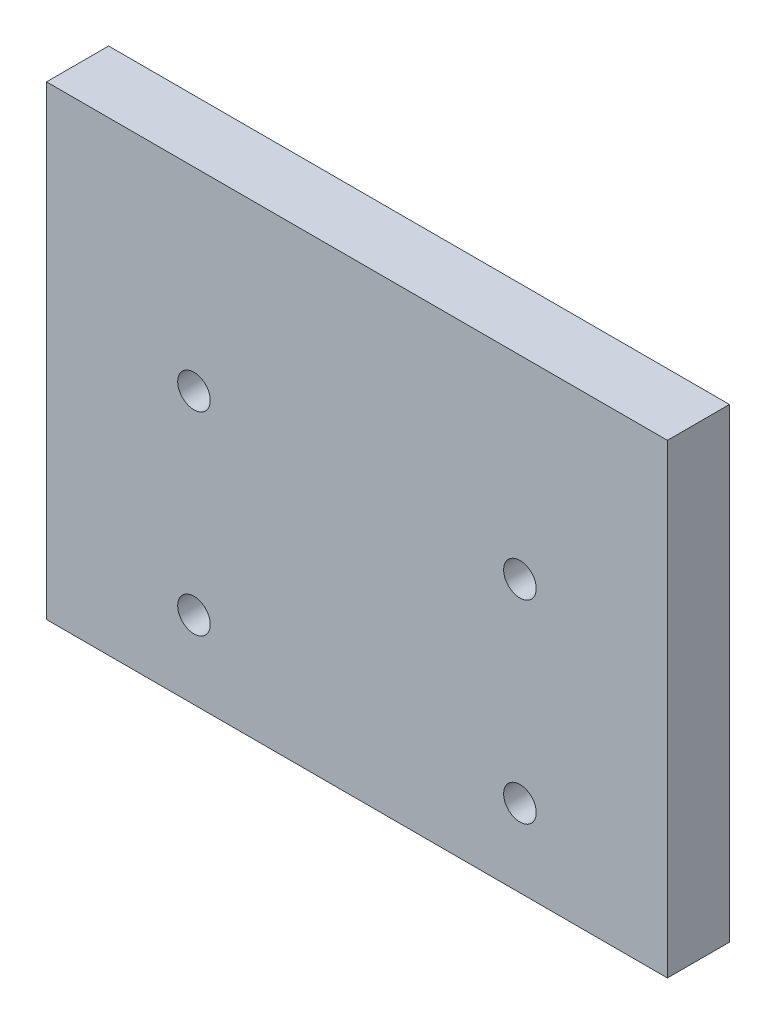
ISO-10303-21;
HEADER;
FILE_DESCRIPTION(('STEP AP214'),'2;1');
FILE_NAME('part.step','',(''),(''),'','','');
FILE_SCHEMA(('AUTOMOTIVE_DESIGN { 1 0 10303 214 1 1 1 1 }'));
ENDSEC;
DATA;
#1=APPLICATION_CONTEXT('core data for automotive mechanical design processes');
#2=APPLICATION_PROTOCOL_DEFINITION('international standard','automotive_design',2000,#1);
#3=PRODUCT_CONTEXT('',#1,'mechanical');
#4=PRODUCT('Part','Part','',(#3));
#5=PRODUCT_RELATED_PRODUCT_CATEGORY('part','',(#4));
#6=PRODUCT_DEFINITION_FORMATION('','',#4);
#7=PRODUCT_DEFINITION_CONTEXT('part definition',#1,'design');
#8=PRODUCT_DEFINITION('design','',#6,#7);
#9=PRODUCT_DEFINITION_SHAPE('','',#8);
#10=(LENGTH_UNIT() NAMED_UNIT(*) SI_UNIT(.MILLI.,.METRE.));
#11=(NAMED_UNIT(*) PLANE_ANGLE_UNIT() SI_UNIT($,.RADIAN.));
#12=(NAMED_UNIT(*) SI_UNIT($,.STERADIAN.) SOLID_ANGLE_UNIT());
#13=UNCERTAINTY_MEASURE_WITH_UNIT(LENGTH_MEASURE(1.E-05),#10,'distance_accuracy_value','');
#14=(GEOMETRIC_REPRESENTATION_CONTEXT(3) GLOBAL_UNCERTAINTY_ASSIGNED_CONTEXT((#13)) GLOBAL_UNIT_ASSIGNED_CONTEXT((#10,
#11,#12)) REPRESENTATION_CONTEXT('',''));
#15=CARTESIAN_POINT('',(0.,0.,0.));
#16=DIRECTION('',(0.,0.,1.));
#17=DIRECTION('',(1.,0.,0.));
#18=AXIS2_PLACEMENT_3D('',#15,#16,#17);
#19=CARTESIAN_POINT('',(20.,15.,4.));
#20=DIRECTION('',(-1.,0.,0.));
#21=DIRECTION('',(0.,-1.,0.));
#22=AXIS2_PLACEMENT_3D('',#19,#20,#21);
#23=PLANE('',#22);
#24=DIRECTION('',(0.,1.,0.));
#25=VECTOR('',#24,1.);
#26=CARTESIAN_POINT('',(20.,15.,0.));
#27=LINE('',#26,#25);
#28=CARTESIAN_POINT('',(20.,-15.,0.));
#29=VERTEX_POINT('',#28);
#30=CARTESIAN_POINT('',(20.,15.,0.));
#31=VERTEX_POINT('',#30);
#32=EDGE_CURVE('E95',#29,#31,#27,.T.);
#33=ORIENTED_EDGE('',*,*,#32,.T.);
#34=DIRECTION('',(0.,0.,-1.));
#35=VECTOR('',#34,1.);
#36=CARTESIAN_POINT('',(20.,15.,4.));
#37=LINE('',#36,#35);
#38=CARTESIAN_POINT('',(20.,15.,4.));
#39=VERTEX_POINT('',#38);
#40=EDGE_CURVE('E11',#39,#31,#37,.T.);
#41=ORIENTED_EDGE('',*,*,#40,.F.);
#42=DIRECTION('',(0.,1.,0.));
#43=VECTOR('',#42,1.);
#44=CARTESIAN_POINT('',(20.,15.,4.));
#45=LINE('',#44,#43);
#46=CARTESIAN_POINT('',(20.,-15.,4.));
#47=VERTEX_POINT('',#46);
#48=EDGE_CURVE('E83',#47,#39,#45,.T.);
#49=ORIENTED_EDGE('',*,*,#48,.F.);
#50=DIRECTION('',(0.,0.,-1.));
#51=VECTOR('',#50,1.);
#52=CARTESIAN_POINT('',(20.,-15.,4.));
#53=LINE('',#52,#51);
#54=EDGE_CURVE('E91',#47,#29,#53,.T.);
#55=ORIENTED_EDGE('',*,*,#54,.T.);
#56=EDGE_LOOP('',(#33,#41,#49,#55));
#57=FACE_BOUND('',#56,.T.);
#58=ADVANCED_FACE('F32',(#57),#23,.F.);
#59=CARTESIAN_POINT('',(-20.,15.,4.));
#60=DIRECTION('',(0.,-1.,0.));
#61=DIRECTION('',(0.,0.,-1.));
#62=AXIS2_PLACEMENT_3D('',#59,#60,#61);
#63=PLANE('',#62);
#64=DIRECTION('',(-1.,0.,0.));
#65=VECTOR('',#64,1.);
#66=CARTESIAN_POINT('',(-20.,15.,0.));
#67=LINE('',#66,#65);
#68=CARTESIAN_POINT('',(-20.,15.,0.));
#69=VERTEX_POINT('',#68);
#70=EDGE_CURVE('E87',#31,#69,#67,.T.);
#71=ORIENTED_EDGE('',*,*,#70,.T.);
#72=DIRECTION('',(0.,0.,-1.));
#73=VECTOR('',#72,1.);
#74=CARTESIAN_POINT('',(-20.,15.,4.));
#75=LINE('',#74,#73);
#76=CARTESIAN_POINT('',(-20.,15.,4.));
#77=VERTEX_POINT('',#76);
#78=EDGE_CURVE('E40',#77,#69,#75,.T.);
#79=ORIENTED_EDGE('',*,*,#78,.F.);
#80=DIRECTION('',(-1.,0.,0.));
#81=VECTOR('',#80,1.);
#82=CARTESIAN_POINT('',(-20.,15.,4.));
#83=LINE('',#82,#81);
#84=EDGE_CURVE('E78',#39,#77,#83,.T.);
#85=ORIENTED_EDGE('',*,*,#84,.F.);
#86=ORIENTED_EDGE('',*,*,#40,.T.);
#87=EDGE_LOOP('',(#71,#79,#85,#86));
#88=FACE_BOUND('',#87,.T.);
#89=ADVANCED_FACE('F86',(#88),#63,.F.);
#90=CARTESIAN_POINT('',(-20.,15.,4.));
#91=DIRECTION('',(1.,0.,0.));
#92=DIRECTION('',(0.,1.,0.));
#93=AXIS2_PLACEMENT_3D('',#90,#91,#92);
#94=PLANE('',#93);
#95=DIRECTION('',(0.,-1.,0.));
#96=VECTOR('',#95,1.);
#97=CARTESIAN_POINT('',(-20.,15.,0.));
#98=LINE('',#97,#96);
#99=CARTESIAN_POINT('',(-20.,-15.,0.));
#100=VERTEX_POINT('',#99);
#101=EDGE_CURVE('E65',#69,#100,#98,.T.);
#102=ORIENTED_EDGE('',*,*,#101,.T.);
#103=DIRECTION('',(0.,0.,-1.));
#104=VECTOR('',#103,1.);
#105=CARTESIAN_POINT('',(-20.,-15.,4.));
#106=LINE('',#105,#104);
#107=CARTESIAN_POINT('',(-20.,-15.,4.));
#108=VERTEX_POINT('',#107);
#109=EDGE_CURVE('E88',#108,#100,#106,.T.);
#110=ORIENTED_EDGE('',*,*,#109,.F.);
#111=DIRECTION('',(0.,-1.,0.));
#112=VECTOR('',#111,1.);
#113=CARTESIAN_POINT('',(-20.,15.,4.));
#114=LINE('',#113,#112);
#115=EDGE_CURVE('E81',#77,#108,#114,.T.);
#116=ORIENTED_EDGE('',*,*,#115,.F.);
#117=ORIENTED_EDGE('',*,*,#78,.T.);
#118=EDGE_LOOP('',(#102,#110,#116,#117));
#119=FACE_BOUND('',#118,.T.);
#120=ADVANCED_FACE('F89',(#119),#94,.F.);
#121=CARTESIAN_POINT('',(-20.,-15.,4.));
#122=DIRECTION('',(0.,1.,0.));
#123=DIRECTION('',(0.,0.,1.));
#124=AXIS2_PLACEMENT_3D('',#121,#122,#123);
#125=PLANE('',#124);
#126=DIRECTION('',(1.,0.,0.));
#127=VECTOR('',#126,1.);
#128=CARTESIAN_POINT('',(-20.,-15.,0.));
#129=LINE('',#128,#127);
#130=EDGE_CURVE('E71',#100,#29,#129,.T.);
#131=ORIENTED_EDGE('',*,*,#130,.T.);
#132=ORIENTED_EDGE('',*,*,#54,.F.);
#133=DIRECTION('',(1.,0.,0.));
#134=VECTOR('',#133,1.);
#135=CARTESIAN_POINT('',(-20.,-15.,4.));
#136=LINE('',#135,#134);
#137=EDGE_CURVE('E48',#108,#47,#136,.T.);
#138=ORIENTED_EDGE('',*,*,#137,.F.);
#139=ORIENTED_EDGE('',*,*,#109,.T.);
#140=EDGE_LOOP('',(#131,#132,#138,#139));
#141=FACE_BOUND('',#140,.T.);
#142=ADVANCED_FACE('F103',(#141),#125,.F.);
#143=CARTESIAN_POINT('',(0.,0.,4.));
#144=DIRECTION('',(0.,0.,1.));
#145=DIRECTION('',(1.,0.,0.));
#146=AXIS2_PLACEMENT_3D('',#143,#144,#145);
#147=PLANE('',#146);
#148=CARTESIAN_POINT('',(-10.5,-10.,4.));
#149=DIRECTION('',(0.,0.,-1.));
#150=DIRECTION('',(-1.,0.,0.));
#151=AXIS2_PLACEMENT_3D('',#148,#149,#150);
#152=CIRCLE('',#151,1.05);
#153=CARTESIAN_POINT('',(-11.55,-10.,4.));
#154=VERTEX_POINT('',#153);
#155=EDGE_CURVE('E124',#154,#154,#152,.T.);
#156=ORIENTED_EDGE('',*,*,#155,.T.);
#157=EDGE_LOOP('',(#156));
#158=FACE_BOUND('',#157,.T.);
#159=CARTESIAN_POINT('',(10.5,-10.,4.));
#160=DIRECTION('',(0.,0.,-1.));
#161=DIRECTION('',(-1.,0.,0.));
#162=AXIS2_PLACEMENT_3D('',#159,#160,#161);
#163=CIRCLE('',#162,1.05);
#164=CARTESIAN_POINT('',(9.45,-10.,4.));
#165=VERTEX_POINT('',#164);
#166=EDGE_CURVE('E118',#165,#165,#163,.T.);
#167=ORIENTED_EDGE('',*,*,#166,.T.);
#168=EDGE_LOOP('',(#167));
#169=FACE_BOUND('',#168,.T.);
#170=CARTESIAN_POINT('',(-10.5,2.50000000000001,4.));
#171=DIRECTION('',(0.,0.,-1.));
#172=DIRECTION('',(-1.,0.,0.));
#173=AXIS2_PLACEMENT_3D('',#170,#171,#172);
#174=CIRCLE('',#173,1.05);
#175=CARTESIAN_POINT('',(-11.55,2.50000000000001,4.));
#176=VERTEX_POINT('',#175);
#177=EDGE_CURVE('E112',#176,#176,#174,.T.);
#178=ORIENTED_EDGE('',*,*,#177,.T.);
#179=EDGE_LOOP('',(#178));
#180=FACE_BOUND('',#179,.T.);
#181=CARTESIAN_POINT('',(10.5,2.50000000000001,4.));
#182=DIRECTION('',(0.,0.,-1.));
#183=DIRECTION('',(-1.,0.,0.));
#184=AXIS2_PLACEMENT_3D('',#181,#182,#183);
#185=CIRCLE('',#184,1.05);
#186=CARTESIAN_POINT('',(9.45,2.50000000000001,4.));
#187=VERTEX_POINT('',#186);
#188=EDGE_CURVE('E98',#187,#187,#185,.T.);
#189=ORIENTED_EDGE('',*,*,#188,.T.);
#190=EDGE_LOOP('',(#189));
#191=FACE_BOUND('',#190,.T.);
#192=ORIENTED_EDGE('',*,*,#48,.T.);
#193=ORIENTED_EDGE('',*,*,#84,.T.);
#194=ORIENTED_EDGE('',*,*,#115,.T.);
#195=ORIENTED_EDGE('',*,*,#137,.T.);
#196=EDGE_LOOP('',(#192,#193,#194,#195));
#197=FACE_BOUND('',#196,.T.);
#198=ADVANCED_FACE('F79',(#158,#169,#180,#191,#197),#147,.T.);
#199=CARTESIAN_POINT('',(0.,0.,0.));
#200=DIRECTION('',(0.,0.,1.));
#201=DIRECTION('',(1.,0.,0.));
#202=AXIS2_PLACEMENT_3D('',#199,#200,#201);
#203=PLANE('',#202);
#204=CARTESIAN_POINT('',(-10.5,-10.,0.));
#205=DIRECTION('',(0.,0.,-1.));
#206=DIRECTION('',(-1.,0.,0.));
#207=AXIS2_PLACEMENT_3D('',#204,#205,#206);
#208=CIRCLE('',#207,1.05);
#209=CARTESIAN_POINT('',(-11.55,-10.,0.));
#210=VERTEX_POINT('',#209);
#211=EDGE_CURVE('E127',#210,#210,#208,.T.);
#212=ORIENTED_EDGE('',*,*,#211,.F.);
#213=EDGE_LOOP('',(#212));
#214=FACE_BOUND('',#213,.T.);
#215=CARTESIAN_POINT('',(10.5,-10.,0.));
#216=DIRECTION('',(0.,0.,-1.));
#217=DIRECTION('',(-1.,0.,0.));
#218=AXIS2_PLACEMENT_3D('',#215,#216,#217);
#219=CIRCLE('',#218,1.05);
#220=CARTESIAN_POINT('',(9.45,-10.,0.));
#221=VERTEX_POINT('',#220);
#222=EDGE_CURVE('E121',#221,#221,#219,.T.);
#223=ORIENTED_EDGE('',*,*,#222,.F.);
#224=EDGE_LOOP('',(#223));
#225=FACE_BOUND('',#224,.T.);
#226=CARTESIAN_POINT('',(-10.5,2.50000000000001,0.));
#227=DIRECTION('',(0.,0.,-1.));
#228=DIRECTION('',(-1.,0.,0.));
#229=AXIS2_PLACEMENT_3D('',#226,#227,#228);
#230=CIRCLE('',#229,1.05);
#231=CARTESIAN_POINT('',(-11.55,2.50000000000001,0.));
#232=VERTEX_POINT('',#231);
#233=EDGE_CURVE('E115',#232,#232,#230,.T.);
#234=ORIENTED_EDGE('',*,*,#233,.F.);
#235=EDGE_LOOP('',(#234));
#236=FACE_BOUND('',#235,.T.);
#237=CARTESIAN_POINT('',(10.5,2.50000000000001,0.));
#238=DIRECTION('',(0.,0.,-1.));
#239=DIRECTION('',(-1.,0.,0.));
#240=AXIS2_PLACEMENT_3D('',#237,#238,#239);
#241=CIRCLE('',#240,1.05);
#242=CARTESIAN_POINT('',(9.45,2.50000000000001,0.));
#243=VERTEX_POINT('',#242);
#244=EDGE_CURVE('E109',#243,#243,#241,.T.);
#245=ORIENTED_EDGE('',*,*,#244,.F.);
#246=EDGE_LOOP('',(#245));
#247=FACE_BOUND('',#246,.T.);
#248=ORIENTED_EDGE('',*,*,#32,.F.);
#249=ORIENTED_EDGE('',*,*,#130,.F.);
#250=ORIENTED_EDGE('',*,*,#101,.F.);
#251=ORIENTED_EDGE('',*,*,#70,.F.);
#252=EDGE_LOOP('',(#248,#249,#250,#251));
#253=FACE_BOUND('',#252,.T.);
#254=ADVANCED_FACE('F106',(#214,#225,#236,#247,#253),#203,.F.);
#255=CARTESIAN_POINT('',(10.5,2.50000000000001,4.));
#256=DIRECTION('',(0.,0.,-1.));
#257=DIRECTION('',(-1.,0.,0.));
#258=AXIS2_PLACEMENT_3D('',#255,#256,#257);
#259=CYLINDRICAL_SURFACE('',#258,1.05);
#260=ORIENTED_EDGE('',*,*,#188,.F.);
#261=EDGE_LOOP('',(#260));
#262=FACE_BOUND('',#261,.T.);
#263=ORIENTED_EDGE('',*,*,#244,.T.);
#264=EDGE_LOOP('',(#263));
#265=FACE_BOUND('',#264,.T.);
#266=ADVANCED_FACE('F144',(#262,#265),#259,.F.);
#267=CARTESIAN_POINT('',(-10.5,2.50000000000001,4.));
#268=DIRECTION('',(0.,0.,-1.));
#269=DIRECTION('',(-1.,0.,0.));
#270=AXIS2_PLACEMENT_3D('',#267,#268,#269);
#271=CYLINDRICAL_SURFACE('',#270,1.05);
#272=ORIENTED_EDGE('',*,*,#177,.F.);
#273=EDGE_LOOP('',(#272));
#274=FACE_BOUND('',#273,.T.);
#275=ORIENTED_EDGE('',*,*,#233,.T.);
#276=EDGE_LOOP('',(#275));
#277=FACE_BOUND('',#276,.T.);
#278=ADVANCED_FACE('F153',(#274,#277),#271,.F.);
#279=CARTESIAN_POINT('',(10.5,-10.,4.));
#280=DIRECTION('',(0.,0.,-1.));
#281=DIRECTION('',(-1.,0.,0.));
#282=AXIS2_PLACEMENT_3D('',#279,#280,#281);
#283=CYLINDRICAL_SURFACE('',#282,1.05);
#284=ORIENTED_EDGE('',*,*,#166,.F.);
#285=EDGE_LOOP('',(#284));
#286=FACE_BOUND('',#285,.T.);
#287=ORIENTED_EDGE('',*,*,#222,.T.);
#288=EDGE_LOOP('',(#287));
#289=FACE_BOUND('',#288,.T.);
#290=ADVANCED_FACE('F138',(#286,#289),#283,.F.);
#291=CARTESIAN_POINT('',(-10.5,-10.,4.));
#292=DIRECTION('',(0.,0.,-1.));
#293=DIRECTION('',(-1.,0.,0.));
#294=AXIS2_PLACEMENT_3D('',#291,#292,#293);
#295=CYLINDRICAL_SURFACE('',#294,1.05);
#296=ORIENTED_EDGE('',*,*,#155,.F.);
#297=EDGE_LOOP('',(#296));
#298=FACE_BOUND('',#297,.T.);
#299=ORIENTED_EDGE('',*,*,#211,.T.);
#300=EDGE_LOOP('',(#299));
#301=FACE_BOUND('',#300,.T.);
#302=ADVANCED_FACE('F135',(#298,#301),#295,.F.);
#303=CLOSED_SHELL('',(#58,#89,#120,#142,#198,#254,#266,#278,#290,#302));
#304=MANIFOLD_SOLID_BREP('B2',#303);
#305=ADVANCED_BREP_SHAPE_REPRESENTATION('',(#18,#304),#14);
#306=SHAPE_DEFINITION_REPRESENTATION(#9,#305);
ENDSEC;
END-ISO-10303-21;
